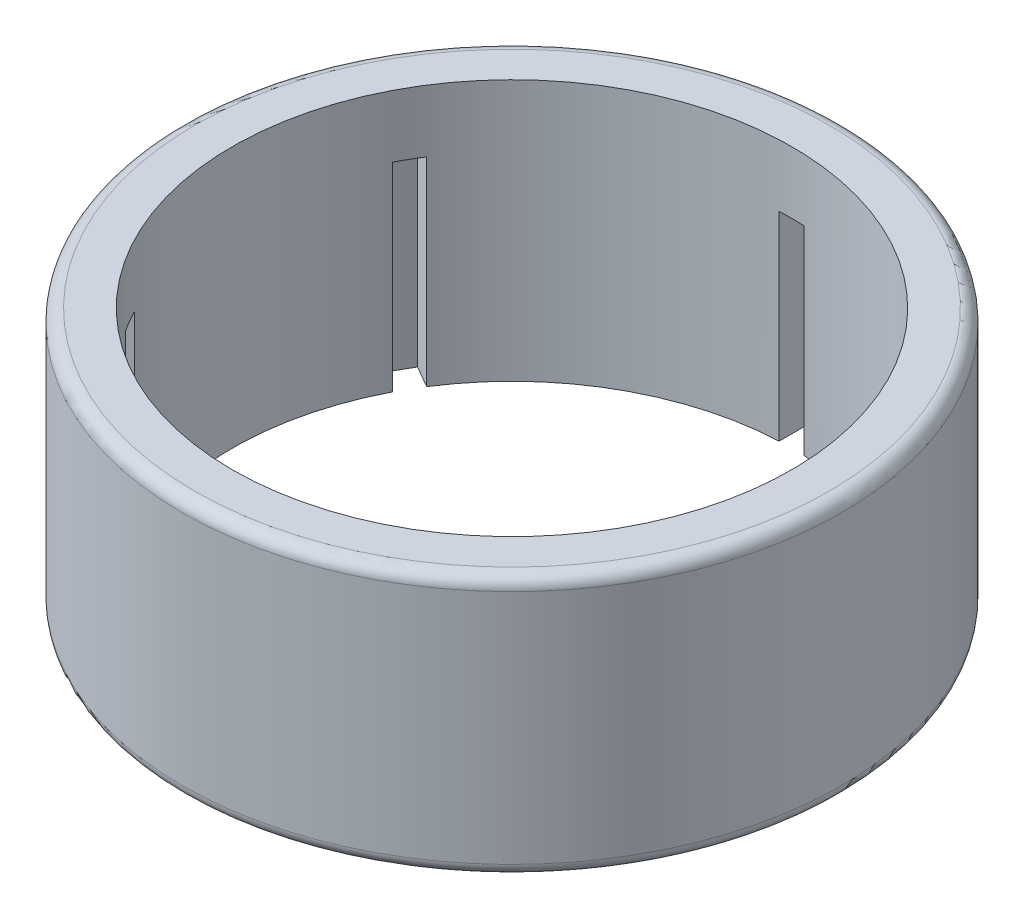
ISO-10303-21;
HEADER;
FILE_DESCRIPTION(('STEP AP214'),'2;1');
FILE_NAME('part.step','',(''),(''),'','','');
FILE_SCHEMA(('AUTOMOTIVE_DESIGN { 1 0 10303 214 1 1 1 1 }'));
ENDSEC;
DATA;
#1=APPLICATION_CONTEXT('core data for automotive mechanical design processes');
#2=APPLICATION_PROTOCOL_DEFINITION('international standard','automotive_design',2000,#1);
#3=PRODUCT_CONTEXT('',#1,'mechanical');
#4=PRODUCT('Part','Part','',(#3));
#5=PRODUCT_RELATED_PRODUCT_CATEGORY('part','',(#4));
#6=PRODUCT_DEFINITION_FORMATION('','',#4);
#7=PRODUCT_DEFINITION_CONTEXT('part definition',#1,'design');
#8=PRODUCT_DEFINITION('design','',#6,#7);
#9=PRODUCT_DEFINITION_SHAPE('','',#8);
#10=(LENGTH_UNIT() NAMED_UNIT(*) SI_UNIT(.MILLI.,.METRE.));
#11=(NAMED_UNIT(*) PLANE_ANGLE_UNIT() SI_UNIT($,.RADIAN.));
#12=(NAMED_UNIT(*) SI_UNIT($,.STERADIAN.) SOLID_ANGLE_UNIT());
#13=UNCERTAINTY_MEASURE_WITH_UNIT(LENGTH_MEASURE(1.E-05),#10,'distance_accuracy_value','');
#14=(GEOMETRIC_REPRESENTATION_CONTEXT(3) GLOBAL_UNCERTAINTY_ASSIGNED_CONTEXT((#13)) GLOBAL_UNIT_ASSIGNED_CONTEXT((#10,
#11,#12)) REPRESENTATION_CONTEXT('',''));
#15=CARTESIAN_POINT('',(0.,0.,0.));
#16=DIRECTION('',(0.,0.,1.));
#17=DIRECTION('',(1.,0.,0.));
#18=AXIS2_PLACEMENT_3D('',#15,#16,#17);
#19=CARTESIAN_POINT('',(0.,0.,0.));
#20=DIRECTION('',(0.,1.,0.));
#21=DIRECTION('',(0.,0.,1.));
#22=AXIS2_PLACEMENT_3D('',#19,#20,#21);
#23=PLANE('',#22);
#24=CARTESIAN_POINT('',(0.,0.,0.));
#25=DIRECTION('',(0.,1.,0.));
#26=DIRECTION('',(0.,0.,1.));
#27=AXIS2_PLACEMENT_3D('',#24,#25,#26);
#28=CIRCLE('',#27,25.5);
#29=CARTESIAN_POINT('',(0.,0.,25.5));
#30=VERTEX_POINT('',#29);
#31=EDGE_CURVE('E64',#30,#30,#28,.F.);
#32=ORIENTED_EDGE('',*,*,#31,.T.);
#33=EDGE_LOOP('',(#32));
#34=FACE_BOUND('',#33,.T.);
#35=DIRECTION('',(-0.866025403784433,0.,0.50000000000001));
#36=VECTOR('',#35,1.);
#37=CARTESIAN_POINT('',(-0.500000000000013,0.,-0.866025403784437));
#38=LINE('',#37,#36);
#39=CARTESIAN_POINT('',(-19.9663170630706,0.,10.3728579927103));
#40=VERTEX_POINT('',#39);
#41=CARTESIAN_POINT('',(-21.6983678706395,0.,11.3728579927103));
#42=VERTEX_POINT('',#41);
#43=EDGE_CURVE('E314',#40,#42,#38,.T.);
#44=ORIENTED_EDGE('',*,*,#43,.T.);
#45=DIRECTION('',(0.50000000000001,0.,0.866025403784433));
#46=VECTOR('',#45,1.);
#47=CARTESIAN_POINT('',(-21.1983678706395,0.,12.2388833964948));
#48=LINE('',#47,#46);
#49=CARTESIAN_POINT('',(-20.6983678706395,0.,13.1049088002792));
#50=VERTEX_POINT('',#49);
#51=EDGE_CURVE('E318',#42,#50,#48,.T.);
#52=ORIENTED_EDGE('',*,*,#51,.T.);
#53=DIRECTION('',(0.866025403784433,0.,-0.50000000000001));
#54=VECTOR('',#53,1.);
#55=CARTESIAN_POINT('',(0.500000000000012,0.,0.866025403784437));
#56=LINE('',#55,#54);
#57=CARTESIAN_POINT('',(-18.9663170630706,0.,12.1049088002792));
#58=VERTEX_POINT('',#57);
#59=EDGE_CURVE('E322',#50,#58,#56,.T.);
#60=ORIENTED_EDGE('',*,*,#59,.T.);
#61=CARTESIAN_POINT('',(0.,0.,0.));
#62=DIRECTION('',(0.,1.,0.));
#63=DIRECTION('',(0.,0.,1.));
#64=AXIS2_PLACEMENT_3D('',#61,#62,#63);
#65=CIRCLE('',#64,22.5);
#66=CARTESIAN_POINT('',(-1.,0.,22.477766792989));
#67=VERTEX_POINT('',#66);
#68=EDGE_CURVE('E391',#58,#67,#65,.T.);
#69=ORIENTED_EDGE('',*,*,#68,.T.);
#70=DIRECTION('',(0.,0.,1.));
#71=VECTOR('',#70,1.);
#72=CARTESIAN_POINT('',(-1.00000000000001,0.,0.));
#73=LINE('',#72,#71);
#74=CARTESIAN_POINT('',(-1.,0.,24.477766792989));
#75=VERTEX_POINT('',#74);
#76=EDGE_CURVE('E368',#67,#75,#73,.T.);
#77=ORIENTED_EDGE('',*,*,#76,.T.);
#78=DIRECTION('',(1.,0.,0.));
#79=VECTOR('',#78,1.);
#80=CARTESIAN_POINT('',(0.,0.,24.477766792989));
#81=LINE('',#80,#79);
#82=CARTESIAN_POINT('',(1.,0.,24.477766792989));
#83=VERTEX_POINT('',#82);
#84=EDGE_CURVE('E373',#75,#83,#81,.T.);
#85=ORIENTED_EDGE('',*,*,#84,.T.);
#86=DIRECTION('',(0.,0.,-1.));
#87=VECTOR('',#86,1.);
#88=CARTESIAN_POINT('',(1.00000000000001,0.,0.));
#89=LINE('',#88,#87);
#90=CARTESIAN_POINT('',(1.,0.,22.477766792989));
#91=VERTEX_POINT('',#90);
#92=EDGE_CURVE('E377',#83,#91,#89,.T.);
#93=ORIENTED_EDGE('',*,*,#92,.T.);
#94=CARTESIAN_POINT('',(18.9663170630708,0.,12.1049088002789));
#95=VERTEX_POINT('',#94);
#96=EDGE_CURVE('E401',#91,#95,#65,.T.);
#97=ORIENTED_EDGE('',*,*,#96,.T.);
#98=DIRECTION('',(0.86602540378444,0.,0.499999999999998));
#99=VECTOR('',#98,1.);
#100=CARTESIAN_POINT('',(-0.5,0.,0.866025403784444));
#101=LINE('',#100,#99);
#102=CARTESIAN_POINT('',(20.6983678706397,0.,13.1049088002789));
#103=VERTEX_POINT('',#102);
#104=EDGE_CURVE('E339',#95,#103,#101,.T.);
#105=ORIENTED_EDGE('',*,*,#104,.T.);
#106=DIRECTION('',(0.499999999999998,0.,-0.86602540378444));
#107=VECTOR('',#106,1.);
#108=CARTESIAN_POINT('',(21.1983678706397,0.,12.2388833964945));
#109=LINE('',#108,#107);
#110=CARTESIAN_POINT('',(21.6983678706397,0.,11.37285799271));
#111=VERTEX_POINT('',#110);
#112=EDGE_CURVE('E344',#103,#111,#109,.T.);
#113=ORIENTED_EDGE('',*,*,#112,.T.);
#114=DIRECTION('',(-0.86602540378444,0.,-0.499999999999998));
#115=VECTOR('',#114,1.);
#116=CARTESIAN_POINT('',(0.500000000000001,0.,-0.866025403784444));
#117=LINE('',#116,#115);
#118=CARTESIAN_POINT('',(19.9663170630708,0.,10.37285799271));
#119=VERTEX_POINT('',#118);
#120=EDGE_CURVE('E348',#111,#119,#117,.T.);
#121=ORIENTED_EDGE('',*,*,#120,.T.);
#122=CARTESIAN_POINT('',(19.9663170630707,0.,-10.3728579927102));
#123=VERTEX_POINT('',#122);
#124=EDGE_CURVE('E404',#119,#123,#65,.T.);
#125=ORIENTED_EDGE('',*,*,#124,.T.);
#126=DIRECTION('',(0.866025403784436,0.,-0.500000000000004));
#127=VECTOR('',#126,1.);
#128=CARTESIAN_POINT('',(0.500000000000007,0.,0.866025403784441));
#129=LINE('',#128,#127);
#130=CARTESIAN_POINT('',(21.6983678706396,0.,-11.3728579927102));
#131=VERTEX_POINT('',#130);
#132=EDGE_CURVE('E256',#123,#131,#129,.T.);
#133=ORIENTED_EDGE('',*,*,#132,.T.);
#134=DIRECTION('',(-0.500000000000004,0.,-0.866025403784436));
#135=VECTOR('',#134,1.);
#136=CARTESIAN_POINT('',(21.1983678706396,0.,-12.2388833964946));
#137=LINE('',#136,#135);
#138=CARTESIAN_POINT('',(20.6983678706396,0.,-13.1049088002791));
#139=VERTEX_POINT('',#138);
#140=EDGE_CURVE('E230',#131,#139,#137,.T.);
#141=ORIENTED_EDGE('',*,*,#140,.T.);
#142=DIRECTION('',(-0.866025403784437,0.,0.500000000000004));
#143=VECTOR('',#142,1.);
#144=CARTESIAN_POINT('',(-0.500000000000007,0.,-0.866025403784441));
#145=LINE('',#144,#143);
#146=CARTESIAN_POINT('',(18.9663170630707,0.,-12.104908800279));
#147=VERTEX_POINT('',#146);
#148=EDGE_CURVE('E225',#139,#147,#145,.T.);
#149=ORIENTED_EDGE('',*,*,#148,.T.);
#150=CARTESIAN_POINT('',(1.,0.,-22.477766792989));
#151=VERTEX_POINT('',#150);
#152=EDGE_CURVE('E842',#147,#151,#65,.T.);
#153=ORIENTED_EDGE('',*,*,#152,.T.);
#154=DIRECTION('',(0.,0.,-1.));
#155=VECTOR('',#154,1.);
#156=CARTESIAN_POINT('',(1.00000000000001,0.,0.));
#157=LINE('',#156,#155);
#158=CARTESIAN_POINT('',(1.,0.,-24.477766792989));
#159=VERTEX_POINT('',#158);
#160=EDGE_CURVE('E259',#151,#159,#157,.T.);
#161=ORIENTED_EDGE('',*,*,#160,.T.);
#162=DIRECTION('',(-1.,0.,0.));
#163=VECTOR('',#162,1.);
#164=CARTESIAN_POINT('',(0.,0.,-24.477766792989));
#165=LINE('',#164,#163);
#166=CARTESIAN_POINT('',(-1.,0.,-24.477766792989));
#167=VERTEX_POINT('',#166);
#168=EDGE_CURVE('E264',#159,#167,#165,.T.);
#169=ORIENTED_EDGE('',*,*,#168,.T.);
#170=DIRECTION('',(0.,0.,1.));
#171=VECTOR('',#170,1.);
#172=CARTESIAN_POINT('',(-1.00000000000001,0.,0.));
#173=LINE('',#172,#171);
#174=CARTESIAN_POINT('',(-1.,0.,-22.477766792989));
#175=VERTEX_POINT('',#174);
#176=EDGE_CURVE('E268',#167,#175,#173,.T.);
#177=ORIENTED_EDGE('',*,*,#176,.T.);
#178=CARTESIAN_POINT('',(-18.9663170630709,0.,-12.1049088002788));
#179=VERTEX_POINT('',#178);
#180=EDGE_CURVE('E847',#175,#179,#65,.T.);
#181=ORIENTED_EDGE('',*,*,#180,.T.);
#182=DIRECTION('',(-0.866025403784443,0.,-0.499999999999992));
#183=VECTOR('',#182,1.);
#184=CARTESIAN_POINT('',(0.499999999999994,0.,-0.866025403784448));
#185=LINE('',#184,#183);
#186=CARTESIAN_POINT('',(-20.6983678706398,0.,-13.1049088002788));
#187=VERTEX_POINT('',#186);
#188=EDGE_CURVE('E288',#179,#187,#185,.T.);
#189=ORIENTED_EDGE('',*,*,#188,.T.);
#190=DIRECTION('',(-0.499999999999992,0.,0.866025403784443));
#191=VECTOR('',#190,1.);
#192=CARTESIAN_POINT('',(-21.1983678706398,0.,-12.2388833964943));
#193=LINE('',#192,#191);
#194=CARTESIAN_POINT('',(-21.6983678706397,0.,-11.3728579927099));
#195=VERTEX_POINT('',#194);
#196=EDGE_CURVE('E292',#187,#195,#193,.T.);
#197=ORIENTED_EDGE('',*,*,#196,.T.);
#198=DIRECTION('',(0.866025403784443,0.,0.499999999999992));
#199=VECTOR('',#198,1.);
#200=CARTESIAN_POINT('',(-0.499999999999995,0.,0.866025403784448));
#201=LINE('',#200,#199);
#202=CARTESIAN_POINT('',(-19.9663170630709,0.,-10.3728579927099));
#203=VERTEX_POINT('',#202);
#204=EDGE_CURVE('E296',#195,#203,#201,.T.);
#205=ORIENTED_EDGE('',*,*,#204,.T.);
#206=EDGE_CURVE('E849',#203,#40,#65,.T.);
#207=ORIENTED_EDGE('',*,*,#206,.T.);
#208=EDGE_LOOP('',(#44,#52,#60,#69,#77,#85,#93,#97,#105,#113,#121,#125,#133,#141,#149,#153,#161,
#169,#177,#181,#189,#197,#205,#207));
#209=FACE_BOUND('',#208,.T.);
#210=ADVANCED_FACE('F56',(#34,#209),#23,.F.);
#211=CARTESIAN_POINT('',(0.,21.,0.));
#212=DIRECTION('',(0.,-1.,0.));
#213=DIRECTION('',(0.,0.,-1.));
#214=AXIS2_PLACEMENT_3D('',#211,#212,#213);
#215=CYLINDRICAL_SURFACE('',#214,22.5);
#216=CARTESIAN_POINT('',(0.,21.,0.));
#217=DIRECTION('',(0.,1.,0.));
#218=DIRECTION('',(0.,0.,1.));
#219=AXIS2_PLACEMENT_3D('',#216,#217,#218);
#220=CIRCLE('',#219,22.5);
#221=CARTESIAN_POINT('',(0.,21.,22.5));
#222=VERTEX_POINT('',#221);
#223=EDGE_CURVE('E397',#222,#222,#220,.T.);
#224=ORIENTED_EDGE('',*,*,#223,.T.);
#225=EDGE_LOOP('',(#224));
#226=FACE_BOUND('',#225,.T.);
#227=CARTESIAN_POINT('',(0.,16.,0.));
#228=DIRECTION('',(0.,1.,0.));
#229=DIRECTION('',(0.,0.,1.));
#230=AXIS2_PLACEMENT_3D('',#227,#228,#229);
#231=CIRCLE('',#230,22.5);
#232=CARTESIAN_POINT('',(-19.9663170630706,16.,10.3728579927103));
#233=VERTEX_POINT('',#232);
#234=CARTESIAN_POINT('',(-18.9663170630706,16.,12.1049088002792));
#235=VERTEX_POINT('',#234);
#236=EDGE_CURVE('E330',#233,#235,#231,.T.);
#237=ORIENTED_EDGE('',*,*,#236,.F.);
#238=DIRECTION('',(0.,-1.,0.));
#239=VECTOR('',#238,1.);
#240=CARTESIAN_POINT('',(-19.9663170630706,24.8637033051563,10.3728579927103));
#241=LINE('',#240,#239);
#242=EDGE_CURVE('E71',#233,#40,#241,.T.);
#243=ORIENTED_EDGE('',*,*,#242,.T.);
#244=ORIENTED_EDGE('',*,*,#206,.F.);
#245=DIRECTION('',(0.,-1.,0.));
#246=VECTOR('',#245,1.);
#247=CARTESIAN_POINT('',(-19.9663170630709,24.8637033051563,-10.3728579927099));
#248=LINE('',#247,#246);
#249=CARTESIAN_POINT('',(-19.9663170630709,16.,-10.3728579927099));
#250=VERTEX_POINT('',#249);
#251=EDGE_CURVE('E306',#250,#203,#248,.T.);
#252=ORIENTED_EDGE('',*,*,#251,.F.);
#253=CARTESIAN_POINT('',(0.,16.,0.));
#254=DIRECTION('',(0.,1.,0.));
#255=DIRECTION('',(0.,0.,1.));
#256=AXIS2_PLACEMENT_3D('',#253,#254,#255);
#257=CIRCLE('',#256,22.5);
#258=CARTESIAN_POINT('',(-18.9663170630709,16.,-12.1049088002788));
#259=VERTEX_POINT('',#258);
#260=EDGE_CURVE('E304',#259,#250,#257,.T.);
#261=ORIENTED_EDGE('',*,*,#260,.F.);
#262=DIRECTION('',(0.,-1.,0.));
#263=VECTOR('',#262,1.);
#264=CARTESIAN_POINT('',(-18.9663170630709,24.8637033051563,-12.1049088002788));
#265=LINE('',#264,#263);
#266=EDGE_CURVE('E79',#259,#179,#265,.T.);
#267=ORIENTED_EDGE('',*,*,#266,.T.);
#268=ORIENTED_EDGE('',*,*,#180,.F.);
#269=DIRECTION('',(0.,-1.,0.));
#270=VECTOR('',#269,1.);
#271=CARTESIAN_POINT('',(-1.,23.8284271247462,-22.477766792989));
#272=LINE('',#271,#270);
#273=CARTESIAN_POINT('',(-1.,16.,-22.477766792989));
#274=VERTEX_POINT('',#273);
#275=EDGE_CURVE('E279',#274,#175,#272,.T.);
#276=ORIENTED_EDGE('',*,*,#275,.F.);
#277=CARTESIAN_POINT('',(0.,16.,0.));
#278=DIRECTION('',(0.,1.,0.));
#279=DIRECTION('',(0.,0.,1.));
#280=AXIS2_PLACEMENT_3D('',#277,#278,#279);
#281=CIRCLE('',#280,22.5);
#282=CARTESIAN_POINT('',(1.,16.,-22.477766792989));
#283=VERTEX_POINT('',#282);
#284=EDGE_CURVE('E277',#283,#274,#281,.T.);
#285=ORIENTED_EDGE('',*,*,#284,.F.);
#286=DIRECTION('',(0.,-1.,0.));
#287=VECTOR('',#286,1.);
#288=CARTESIAN_POINT('',(1.,23.8284271247462,-22.477766792989));
#289=LINE('',#288,#287);
#290=EDGE_CURVE('E263',#283,#151,#289,.T.);
#291=ORIENTED_EDGE('',*,*,#290,.T.);
#292=ORIENTED_EDGE('',*,*,#152,.F.);
#293=DIRECTION('',(0.,-1.,0.));
#294=VECTOR('',#293,1.);
#295=CARTESIAN_POINT('',(18.9663170630707,24.8637033051563,-12.104908800279));
#296=LINE('',#295,#294);
#297=CARTESIAN_POINT('',(18.9663170630707,16.,-12.104908800279));
#298=VERTEX_POINT('',#297);
#299=EDGE_CURVE('E250',#298,#147,#296,.T.);
#300=ORIENTED_EDGE('',*,*,#299,.F.);
#301=CARTESIAN_POINT('',(0.,16.,0.));
#302=DIRECTION('',(0.,1.,0.));
#303=DIRECTION('',(0.,0.,1.));
#304=AXIS2_PLACEMENT_3D('',#301,#302,#303);
#305=CIRCLE('',#304,22.5);
#306=CARTESIAN_POINT('',(19.9663170630707,16.,-10.3728579927102));
#307=VERTEX_POINT('',#306);
#308=EDGE_CURVE('E238',#307,#298,#305,.T.);
#309=ORIENTED_EDGE('',*,*,#308,.F.);
#310=DIRECTION('',(0.,-1.,0.));
#311=VECTOR('',#310,1.);
#312=CARTESIAN_POINT('',(19.9663170630707,24.8637033051563,-10.3728579927102));
#313=LINE('',#312,#311);
#314=EDGE_CURVE('E253',#307,#123,#313,.T.);
#315=ORIENTED_EDGE('',*,*,#314,.T.);
#316=ORIENTED_EDGE('',*,*,#124,.F.);
#317=DIRECTION('',(0.,-1.,0.));
#318=VECTOR('',#317,1.);
#319=CARTESIAN_POINT('',(19.9663170630708,24.8637033051563,10.37285799271));
#320=LINE('',#319,#318);
#321=CARTESIAN_POINT('',(19.9663170630708,16.,10.37285799271));
#322=VERTEX_POINT('',#321);
#323=EDGE_CURVE('E359',#322,#119,#320,.T.);
#324=ORIENTED_EDGE('',*,*,#323,.F.);
#325=CARTESIAN_POINT('',(0.,16.,0.));
#326=DIRECTION('',(0.,1.,0.));
#327=DIRECTION('',(0.,0.,1.));
#328=AXIS2_PLACEMENT_3D('',#325,#326,#327);
#329=CIRCLE('',#328,22.5);
#330=CARTESIAN_POINT('',(18.9663170630708,16.,12.1049088002789));
#331=VERTEX_POINT('',#330);
#332=EDGE_CURVE('E239',#331,#322,#329,.T.);
#333=ORIENTED_EDGE('',*,*,#332,.F.);
#334=DIRECTION('',(0.,-1.,0.));
#335=VECTOR('',#334,1.);
#336=CARTESIAN_POINT('',(18.9663170630708,24.8637033051563,12.1049088002789));
#337=LINE('',#336,#335);
#338=EDGE_CURVE('E343',#331,#95,#337,.T.);
#339=ORIENTED_EDGE('',*,*,#338,.T.);
#340=ORIENTED_EDGE('',*,*,#96,.F.);
#341=DIRECTION('',(0.,-1.,0.));
#342=VECTOR('',#341,1.);
#343=CARTESIAN_POINT('',(1.,23.8284271247462,22.477766792989));
#344=LINE('',#343,#342);
#345=CARTESIAN_POINT('',(1.,16.,22.477766792989));
#346=VERTEX_POINT('',#345);
#347=EDGE_CURVE('E388',#346,#91,#344,.T.);
#348=ORIENTED_EDGE('',*,*,#347,.F.);
#349=CARTESIAN_POINT('',(0.,16.,0.));
#350=DIRECTION('',(0.,1.,0.));
#351=DIRECTION('',(0.,0.,1.));
#352=AXIS2_PLACEMENT_3D('',#349,#350,#351);
#353=CIRCLE('',#352,22.5);
#354=CARTESIAN_POINT('',(-1.,16.,22.477766792989));
#355=VERTEX_POINT('',#354);
#356=EDGE_CURVE('E362',#355,#346,#353,.T.);
#357=ORIENTED_EDGE('',*,*,#356,.F.);
#358=DIRECTION('',(0.,-1.,0.));
#359=VECTOR('',#358,1.);
#360=CARTESIAN_POINT('',(-1.,23.8284271247462,22.477766792989));
#361=LINE('',#360,#359);
#362=EDGE_CURVE('E372',#355,#67,#361,.T.);
#363=ORIENTED_EDGE('',*,*,#362,.T.);
#364=ORIENTED_EDGE('',*,*,#68,.F.);
#365=DIRECTION('',(0.,-1.,0.));
#366=VECTOR('',#365,1.);
#367=CARTESIAN_POINT('',(-18.9663170630706,24.8637033051563,12.1049088002792));
#368=LINE('',#367,#366);
#369=EDGE_CURVE('E332',#235,#58,#368,.T.);
#370=ORIENTED_EDGE('',*,*,#369,.F.);
#371=EDGE_LOOP('',(#237,#243,#244,#252,#261,#267,#268,#276,#285,#291,#292,#300,#309,#315,#316,
#324,#333,#339,#340,#348,#357,#363,#364,#370));
#372=FACE_BOUND('',#371,.T.);
#373=ADVANCED_FACE('F434',(#226,#372),#215,.F.);
#374=CARTESIAN_POINT('',(0.,21.,0.));
#375=DIRECTION('',(0.,1.,0.));
#376=DIRECTION('',(0.,0.,1.));
#377=AXIS2_PLACEMENT_3D('',#374,#375,#376);
#378=PLANE('',#377);
#379=CARTESIAN_POINT('',(0.,21.,0.));
#380=DIRECTION('',(0.,1.,0.));
#381=DIRECTION('',(0.,0.,1.));
#382=AXIS2_PLACEMENT_3D('',#379,#380,#381);
#383=CIRCLE('',#382,25.5);
#384=CARTESIAN_POINT('',(0.,21.,25.5));
#385=VERTEX_POINT('',#384);
#386=EDGE_CURVE('E13',#385,#385,#383,.T.);
#387=ORIENTED_EDGE('',*,*,#386,.T.);
#388=EDGE_LOOP('',(#387));
#389=FACE_BOUND('',#388,.T.);
#390=ORIENTED_EDGE('',*,*,#223,.F.);
#391=EDGE_LOOP('',(#390));
#392=FACE_BOUND('',#391,.T.);
#393=ADVANCED_FACE('F424',(#389,#392),#378,.T.);
#394=CARTESIAN_POINT('',(0.,21.,0.));
#395=DIRECTION('',(0.,-1.,0.));
#396=DIRECTION('',(0.,0.,-1.));
#397=AXIS2_PLACEMENT_3D('',#394,#395,#396);
#398=CYLINDRICAL_SURFACE('',#397,26.5);
#399=CARTESIAN_POINT('',(0.,1.,0.));
#400=DIRECTION('',(0.,1.,0.));
#401=DIRECTION('',(0.,0.,1.));
#402=AXIS2_PLACEMENT_3D('',#399,#400,#401);
#403=CIRCLE('',#402,26.5);
#404=CARTESIAN_POINT('',(0.,1.,-26.5));
#405=VERTEX_POINT('',#404);
#406=EDGE_CURVE('E407',#405,#405,#403,.T.);
#407=CARTESIAN_POINT('',(0.,20.,0.));
#408=DIRECTION('',(0.,1.,0.));
#409=DIRECTION('',(0.,0.,1.));
#410=AXIS2_PLACEMENT_3D('',#407,#408,#409);
#411=CIRCLE('',#410,26.5);
#412=CARTESIAN_POINT('',(0.,20.,-26.5));
#413=VERTEX_POINT('',#412);
#414=EDGE_CURVE('E400',#413,#413,#411,.F.);
#415=CARTESIAN_POINT('',(0.,1.,-26.5));
#416=CARTESIAN_POINT('',(0.,1.19791666666667,-26.5));
#417=CARTESIAN_POINT('',(0.,1.39583333333333,-26.5));
#418=CARTESIAN_POINT('',(0.,1.79166666666667,-26.5));
#419=CARTESIAN_POINT('',(0.,1.98958333333334,-26.5));
#420=CARTESIAN_POINT('',(0.,2.38541666666667,-26.5));
#421=CARTESIAN_POINT('',(0.,2.58333333333334,-26.5));
#422=CARTESIAN_POINT('',(0.,2.97916666666667,-26.5));
#423=CARTESIAN_POINT('',(0.,3.17708333333334,-26.5));
#424=CARTESIAN_POINT('',(0.,3.57291666666667,-26.5));
#425=CARTESIAN_POINT('',(0.,3.77083333333333,-26.5));
#426=CARTESIAN_POINT('',(0.,4.16666666666667,-26.5));
#427=CARTESIAN_POINT('',(0.,4.36458333333333,-26.5));
#428=CARTESIAN_POINT('',(0.,4.76041666666667,-26.5));
#429=CARTESIAN_POINT('',(0.,4.95833333333333,-26.5));
#430=CARTESIAN_POINT('',(0.,5.35416666666667,-26.5));
#431=CARTESIAN_POINT('',(0.,5.55208333333333,-26.5));
#432=CARTESIAN_POINT('',(0.,5.94791666666667,-26.5));
#433=CARTESIAN_POINT('',(0.,6.14583333333333,-26.5));
#434=CARTESIAN_POINT('',(0.,6.54166666666667,-26.5));
#435=CARTESIAN_POINT('',(0.,6.73958333333333,-26.5));
#436=CARTESIAN_POINT('',(0.,7.13541666666667,-26.5));
#437=CARTESIAN_POINT('',(0.,7.33333333333333,-26.5));
#438=CARTESIAN_POINT('',(0.,7.72916666666667,-26.5));
#439=CARTESIAN_POINT('',(0.,7.92708333333333,-26.5));
#440=CARTESIAN_POINT('',(0.,8.32291666666667,-26.5));
#441=CARTESIAN_POINT('',(0.,8.52083333333333,-26.5));
#442=CARTESIAN_POINT('',(0.,8.91666666666667,-26.5));
#443=CARTESIAN_POINT('',(0.,9.11458333333333,-26.5));
#444=CARTESIAN_POINT('',(0.,9.51041666666667,-26.5));
#445=CARTESIAN_POINT('',(0.,9.70833333333333,-26.5));
#446=CARTESIAN_POINT('',(0.,10.1041666666667,-26.5));
#447=CARTESIAN_POINT('',(0.,10.3020833333333,-26.5));
#448=CARTESIAN_POINT('',(0.,10.6979166666667,-26.5));
#449=CARTESIAN_POINT('',(0.,10.8958333333333,-26.5));
#450=CARTESIAN_POINT('',(0.,11.2916666666667,-26.5));
#451=CARTESIAN_POINT('',(0.,11.4895833333333,-26.5));
#452=CARTESIAN_POINT('',(0.,11.8854166666667,-26.5));
#453=CARTESIAN_POINT('',(0.,12.0833333333333,-26.5));
#454=CARTESIAN_POINT('',(0.,12.4791666666667,-26.5));
#455=CARTESIAN_POINT('',(0.,12.6770833333333,-26.5));
#456=CARTESIAN_POINT('',(0.,13.0729166666667,-26.5));
#457=CARTESIAN_POINT('',(0.,13.2708333333333,-26.5));
#458=CARTESIAN_POINT('',(0.,13.6666666666667,-26.5));
#459=CARTESIAN_POINT('',(0.,13.8645833333333,-26.5));
#460=CARTESIAN_POINT('',(0.,14.2604166666667,-26.5));
#461=CARTESIAN_POINT('',(0.,14.4583333333333,-26.5));
#462=CARTESIAN_POINT('',(0.,14.8541666666667,-26.5));
#463=CARTESIAN_POINT('',(0.,15.0520833333333,-26.5));
#464=CARTESIAN_POINT('',(0.,15.4479166666667,-26.5));
#465=CARTESIAN_POINT('',(0.,15.6458333333333,-26.5));
#466=CARTESIAN_POINT('',(0.,16.0416666666667,-26.5));
#467=CARTESIAN_POINT('',(0.,16.2395833333333,-26.5));
#468=CARTESIAN_POINT('',(0.,16.6354166666667,-26.5));
#469=CARTESIAN_POINT('',(0.,16.8333333333333,-26.5));
#470=CARTESIAN_POINT('',(0.,17.2291666666667,-26.5));
#471=CARTESIAN_POINT('',(0.,17.4270833333333,-26.5));
#472=CARTESIAN_POINT('',(0.,17.8229166666667,-26.5));
#473=CARTESIAN_POINT('',(0.,18.0208333333333,-26.5));
#474=CARTESIAN_POINT('',(0.,18.4166666666667,-26.5));
#475=CARTESIAN_POINT('',(0.,18.6145833333333,-26.5));
#476=CARTESIAN_POINT('',(0.,19.0104166666667,-26.5));
#477=CARTESIAN_POINT('',(0.,19.2083333333333,-26.5));
#478=CARTESIAN_POINT('',(0.,19.6041666666667,-26.5));
#479=CARTESIAN_POINT('',(0.,19.8020833333333,-26.5));
#480=CARTESIAN_POINT('',(0.,20.,-26.5));
#481=B_SPLINE_CURVE_WITH_KNOTS('',3,(#415,#416,#417,#418,#419,#420,#421,#422,#423,#424,#425,
#426,#427,#428,#429,#430,#431,#432,#433,#434,#435,#436,#437,#438,#439,#440,#441,#442,#443,#444,
#445,#446,#447,#448,#449,#450,#451,#452,#453,#454,#455,#456,#457,#458,#459,#460,#461,#462,#463,
#464,#465,#466,#467,#468,#469,#470,#471,#472,#473,#474,#475,#476,#477,#478,#479,#480),
.UNSPECIFIED.,.F.,.F.,(4,2,2,2,2,2,2,2,2,2,2,2,2,2,2,2,2,2,2,2,2,2,2,2,2,2,2,2,2,2,2,2,4),(0.,
0.593750000000001,1.1875,1.78125,2.375,2.96875,3.5625,4.15625,4.75,5.34375,5.9375,6.53125,7.125,
7.71875,8.3125,8.90625,9.5,10.09375,10.6875,11.28125,11.875,12.46875,13.0625,13.65625,14.25,
14.84375,15.4375,16.03125,16.625,17.21875,17.8125,18.40625,19.),.UNSPECIFIED.);
#482=EDGE_CURVE('BSEAM420',#405,#413,#481,.T.);
#483=ORIENTED_EDGE('',*,*,#406,.T.);
#484=ORIENTED_EDGE('',*,*,#414,.T.);
#485=ORIENTED_EDGE('',*,*,#482,.T.);
#486=ORIENTED_EDGE('',*,*,#482,.F.);
#487=EDGE_LOOP('',(#483,#485,#484,#486));
#488=FACE_BOUND('',#487,.T.);
#489=ADVANCED_FACE('F420',(#488),#398,.T.);
#490=CARTESIAN_POINT('',(-1.00000000000001,23.8284271247462,0.));
#491=DIRECTION('',(1.,0.,0.));
#492=DIRECTION('',(0.,0.,-1.));
#493=AXIS2_PLACEMENT_3D('',#490,#491,#492);
#494=PLANE('',#493);
#495=DIRECTION('',(0.,0.,1.));
#496=VECTOR('',#495,1.);
#497=CARTESIAN_POINT('',(-1.00000000000001,16.,0.));
#498=LINE('',#497,#496);
#499=CARTESIAN_POINT('',(-1.,16.,24.477766792989));
#500=VERTEX_POINT('',#499);
#501=EDGE_CURVE('E380',#355,#500,#498,.T.);
#502=ORIENTED_EDGE('',*,*,#501,.T.);
#503=DIRECTION('',(0.,-1.,0.));
#504=VECTOR('',#503,1.);
#505=CARTESIAN_POINT('',(-1.,23.8284271247462,24.477766792989));
#506=LINE('',#505,#504);
#507=EDGE_CURVE('E371',#500,#75,#506,.T.);
#508=ORIENTED_EDGE('',*,*,#507,.T.);
#509=ORIENTED_EDGE('',*,*,#76,.F.);
#510=ORIENTED_EDGE('',*,*,#362,.F.);
#511=EDGE_LOOP('',(#502,#508,#509,#510));
#512=FACE_BOUND('',#511,.T.);
#513=ADVANCED_FACE('F423',(#512),#494,.T.);
#514=CARTESIAN_POINT('',(0.,23.8284271247462,24.477766792989));
#515=DIRECTION('',(0.,0.,-1.));
#516=DIRECTION('',(-1.,0.,0.));
#517=AXIS2_PLACEMENT_3D('',#514,#515,#516);
#518=PLANE('',#517);
#519=DIRECTION('',(1.,0.,0.));
#520=VECTOR('',#519,1.);
#521=CARTESIAN_POINT('',(0.,16.,24.477766792989));
#522=LINE('',#521,#520);
#523=CARTESIAN_POINT('',(1.,16.,24.477766792989));
#524=VERTEX_POINT('',#523);
#525=EDGE_CURVE('E381',#500,#524,#522,.T.);
#526=ORIENTED_EDGE('',*,*,#525,.T.);
#527=DIRECTION('',(0.,-1.,0.));
#528=VECTOR('',#527,1.);
#529=CARTESIAN_POINT('',(1.,23.8284271247462,24.477766792989));
#530=LINE('',#529,#528);
#531=EDGE_CURVE('E376',#524,#83,#530,.T.);
#532=ORIENTED_EDGE('',*,*,#531,.T.);
#533=ORIENTED_EDGE('',*,*,#84,.F.);
#534=ORIENTED_EDGE('',*,*,#507,.F.);
#535=EDGE_LOOP('',(#526,#532,#533,#534));
#536=FACE_BOUND('',#535,.T.);
#537=ADVANCED_FACE('F482',(#536),#518,.T.);
#538=CARTESIAN_POINT('',(1.00000000000001,23.8284271247462,0.));
#539=DIRECTION('',(-1.,0.,0.));
#540=DIRECTION('',(0.,0.,1.));
#541=AXIS2_PLACEMENT_3D('',#538,#539,#540);
#542=PLANE('',#541);
#543=DIRECTION('',(0.,0.,-1.));
#544=VECTOR('',#543,1.);
#545=CARTESIAN_POINT('',(1.00000000000001,16.,0.));
#546=LINE('',#545,#544);
#547=EDGE_CURVE('E384',#524,#346,#546,.T.);
#548=ORIENTED_EDGE('',*,*,#547,.T.);
#549=ORIENTED_EDGE('',*,*,#347,.T.);
#550=ORIENTED_EDGE('',*,*,#92,.F.);
#551=ORIENTED_EDGE('',*,*,#531,.F.);
#552=EDGE_LOOP('',(#548,#549,#550,#551));
#553=FACE_BOUND('',#552,.T.);
#554=ADVANCED_FACE('F478',(#553),#542,.T.);
#555=CARTESIAN_POINT('',(0.,16.,0.));
#556=DIRECTION('',(0.,1.,0.));
#557=DIRECTION('',(0.,0.,1.));
#558=AXIS2_PLACEMENT_3D('',#555,#556,#557);
#559=PLANE('',#558);
#560=ORIENTED_EDGE('',*,*,#356,.T.);
#561=ORIENTED_EDGE('',*,*,#547,.F.);
#562=ORIENTED_EDGE('',*,*,#525,.F.);
#563=ORIENTED_EDGE('',*,*,#501,.F.);
#564=EDGE_LOOP('',(#560,#561,#562,#563));
#565=FACE_BOUND('',#564,.T.);
#566=ADVANCED_FACE('F474',(#565),#559,.F.);
#567=CARTESIAN_POINT('',(-0.5,24.8637033051563,0.866025403784444));
#568=DIRECTION('',(0.499999999999998,0.,-0.86602540378444));
#569=DIRECTION('',(-0.86602540378444,0.,-0.499999999999998));
#570=AXIS2_PLACEMENT_3D('',#567,#568,#569);
#571=PLANE('',#570);
#572=DIRECTION('',(0.86602540378444,0.,0.499999999999998));
#573=VECTOR('',#572,1.);
#574=CARTESIAN_POINT('',(-0.5,16.,0.866025403784444));
#575=LINE('',#574,#573);
#576=CARTESIAN_POINT('',(20.6983678706397,16.,13.1049088002789));
#577=VERTEX_POINT('',#576);
#578=EDGE_CURVE('E351',#331,#577,#575,.T.);
#579=ORIENTED_EDGE('',*,*,#578,.T.);
#580=DIRECTION('',(0.,-1.,0.));
#581=VECTOR('',#580,1.);
#582=CARTESIAN_POINT('',(20.6983678706397,24.8637033051563,13.1049088002789));
#583=LINE('',#582,#581);
#584=EDGE_CURVE('E342',#577,#103,#583,.T.);
#585=ORIENTED_EDGE('',*,*,#584,.T.);
#586=ORIENTED_EDGE('',*,*,#104,.F.);
#587=ORIENTED_EDGE('',*,*,#338,.F.);
#588=EDGE_LOOP('',(#579,#585,#586,#587));
#589=FACE_BOUND('',#588,.T.);
#590=ADVANCED_FACE('F477',(#589),#571,.T.);
#591=CARTESIAN_POINT('',(21.1983678706397,24.8637033051563,12.2388833964945));
#592=DIRECTION('',(-0.86602540378444,0.,-0.499999999999998));
#593=DIRECTION('',(-0.499999999999998,0.,0.86602540378444));
#594=AXIS2_PLACEMENT_3D('',#591,#592,#593);
#595=PLANE('',#594);
#596=DIRECTION('',(0.499999999999998,0.,-0.86602540378444));
#597=VECTOR('',#596,1.);
#598=CARTESIAN_POINT('',(21.1983678706397,16.,12.2388833964945));
#599=LINE('',#598,#597);
#600=CARTESIAN_POINT('',(21.6983678706397,16.,11.37285799271));
#601=VERTEX_POINT('',#600);
#602=EDGE_CURVE('E352',#577,#601,#599,.T.);
#603=ORIENTED_EDGE('',*,*,#602,.T.);
#604=DIRECTION('',(0.,-1.,0.));
#605=VECTOR('',#604,1.);
#606=CARTESIAN_POINT('',(21.6983678706397,24.8637033051563,11.37285799271));
#607=LINE('',#606,#605);
#608=EDGE_CURVE('E347',#601,#111,#607,.T.);
#609=ORIENTED_EDGE('',*,*,#608,.T.);
#610=ORIENTED_EDGE('',*,*,#112,.F.);
#611=ORIENTED_EDGE('',*,*,#584,.F.);
#612=EDGE_LOOP('',(#603,#609,#610,#611));
#613=FACE_BOUND('',#612,.T.);
#614=ADVANCED_FACE('F498',(#613),#595,.T.);
#615=CARTESIAN_POINT('',(0.500000000000001,24.8637033051563,-0.866025403784444));
#616=DIRECTION('',(-0.499999999999998,0.,0.86602540378444));
#617=DIRECTION('',(0.86602540378444,0.,0.499999999999998));
#618=AXIS2_PLACEMENT_3D('',#615,#616,#617);
#619=PLANE('',#618);
#620=DIRECTION('',(-0.86602540378444,0.,-0.499999999999998));
#621=VECTOR('',#620,1.);
#622=CARTESIAN_POINT('',(0.500000000000001,16.,-0.866025403784444));
#623=LINE('',#622,#621);
#624=EDGE_CURVE('E355',#601,#322,#623,.T.);
#625=ORIENTED_EDGE('',*,*,#624,.T.);
#626=ORIENTED_EDGE('',*,*,#323,.T.);
#627=ORIENTED_EDGE('',*,*,#120,.F.);
#628=ORIENTED_EDGE('',*,*,#608,.F.);
#629=EDGE_LOOP('',(#625,#626,#627,#628));
#630=FACE_BOUND('',#629,.T.);
#631=ADVANCED_FACE('F494',(#630),#619,.T.);
#632=CARTESIAN_POINT('',(0.,16.,0.));
#633=DIRECTION('',(0.,1.,0.));
#634=DIRECTION('',(0.,0.,1.));
#635=AXIS2_PLACEMENT_3D('',#632,#633,#634);
#636=PLANE('',#635);
#637=ORIENTED_EDGE('',*,*,#332,.T.);
#638=ORIENTED_EDGE('',*,*,#624,.F.);
#639=ORIENTED_EDGE('',*,*,#602,.F.);
#640=ORIENTED_EDGE('',*,*,#578,.F.);
#641=EDGE_LOOP('',(#637,#638,#639,#640));
#642=FACE_BOUND('',#641,.T.);
#643=ADVANCED_FACE('F490',(#642),#636,.F.);
#644=CARTESIAN_POINT('',(0.500000000000007,24.8637033051563,0.866025403784441));
#645=DIRECTION('',(-0.500000000000004,0.,-0.866025403784436));
#646=DIRECTION('',(-0.866025403784436,0.,0.500000000000004));
#647=AXIS2_PLACEMENT_3D('',#644,#645,#646);
#648=PLANE('',#647);
#649=DIRECTION('',(0.866025403784436,0.,-0.500000000000004));
#650=VECTOR('',#649,1.);
#651=CARTESIAN_POINT('',(0.500000000000007,16.,0.866025403784441));
#652=LINE('',#651,#650);
#653=CARTESIAN_POINT('',(21.6983678706396,16.,-11.3728579927102));
#654=VERTEX_POINT('',#653);
#655=EDGE_CURVE('E244',#307,#654,#652,.T.);
#656=ORIENTED_EDGE('',*,*,#655,.T.);
#657=DIRECTION('',(0.,-1.,0.));
#658=VECTOR('',#657,1.);
#659=CARTESIAN_POINT('',(21.6983678706396,24.8637033051563,-11.3728579927102));
#660=LINE('',#659,#658);
#661=EDGE_CURVE('E242',#654,#131,#660,.T.);
#662=ORIENTED_EDGE('',*,*,#661,.T.);
#663=ORIENTED_EDGE('',*,*,#132,.F.);
#664=ORIENTED_EDGE('',*,*,#314,.F.);
#665=EDGE_LOOP('',(#656,#662,#663,#664));
#666=FACE_BOUND('',#665,.T.);
#667=ADVANCED_FACE('F493',(#666),#648,.T.);
#668=CARTESIAN_POINT('',(21.1983678706396,24.8637033051563,-12.2388833964946));
#669=DIRECTION('',(-0.866025403784436,0.,0.500000000000004));
#670=DIRECTION('',(0.500000000000004,0.,0.866025403784436));
#671=AXIS2_PLACEMENT_3D('',#668,#669,#670);
#672=PLANE('',#671);
#673=DIRECTION('',(-0.500000000000004,0.,-0.866025403784436));
#674=VECTOR('',#673,1.);
#675=CARTESIAN_POINT('',(21.1983678706396,16.,-12.2388833964946));
#676=LINE('',#675,#674);
#677=CARTESIAN_POINT('',(20.6983678706396,16.,-13.1049088002791));
#678=VERTEX_POINT('',#677);
#679=EDGE_CURVE('E235',#654,#678,#676,.T.);
#680=ORIENTED_EDGE('',*,*,#679,.T.);
#681=DIRECTION('',(0.,-1.,0.));
#682=VECTOR('',#681,1.);
#683=CARTESIAN_POINT('',(20.6983678706396,24.8637033051563,-13.1049088002791));
#684=LINE('',#683,#682);
#685=EDGE_CURVE('E219',#678,#139,#684,.T.);
#686=ORIENTED_EDGE('',*,*,#685,.T.);
#687=ORIENTED_EDGE('',*,*,#140,.F.);
#688=ORIENTED_EDGE('',*,*,#661,.F.);
#689=EDGE_LOOP('',(#680,#686,#687,#688));
#690=FACE_BOUND('',#689,.T.);
#691=ADVANCED_FACE('F241',(#690),#672,.T.);
#692=CARTESIAN_POINT('',(-0.500000000000007,24.8637033051563,-0.866025403784441));
#693=DIRECTION('',(0.500000000000004,0.,0.866025403784436));
#694=DIRECTION('',(0.866025403784436,0.,-0.500000000000004));
#695=AXIS2_PLACEMENT_3D('',#692,#693,#694);
#696=PLANE('',#695);
#697=DIRECTION('',(-0.866025403784436,0.,0.500000000000004));
#698=VECTOR('',#697,1.);
#699=CARTESIAN_POINT('',(-0.500000000000007,16.,-0.866025403784441));
#700=LINE('',#699,#698);
#701=EDGE_CURVE('E222',#678,#298,#700,.T.);
#702=ORIENTED_EDGE('',*,*,#701,.T.);
#703=ORIENTED_EDGE('',*,*,#299,.T.);
#704=ORIENTED_EDGE('',*,*,#148,.F.);
#705=ORIENTED_EDGE('',*,*,#685,.F.);
#706=EDGE_LOOP('',(#702,#703,#704,#705));
#707=FACE_BOUND('',#706,.T.);
#708=ADVANCED_FACE('F221',(#707),#696,.T.);
#709=CARTESIAN_POINT('',(0.,16.,0.));
#710=DIRECTION('',(0.,1.,0.));
#711=DIRECTION('',(0.,0.,1.));
#712=AXIS2_PLACEMENT_3D('',#709,#710,#711);
#713=PLANE('',#712);
#714=ORIENTED_EDGE('',*,*,#308,.T.);
#715=ORIENTED_EDGE('',*,*,#701,.F.);
#716=ORIENTED_EDGE('',*,*,#679,.F.);
#717=ORIENTED_EDGE('',*,*,#655,.F.);
#718=EDGE_LOOP('',(#714,#715,#716,#717));
#719=FACE_BOUND('',#718,.T.);
#720=ADVANCED_FACE('F233',(#719),#713,.F.);
#721=CARTESIAN_POINT('',(1.00000000000001,23.8284271247462,0.));
#722=DIRECTION('',(-1.,0.,0.));
#723=DIRECTION('',(0.,0.,1.));
#724=AXIS2_PLACEMENT_3D('',#721,#722,#723);
#725=PLANE('',#724);
#726=DIRECTION('',(0.,0.,-1.));
#727=VECTOR('',#726,1.);
#728=CARTESIAN_POINT('',(1.00000000000001,16.,0.));
#729=LINE('',#728,#727);
#730=CARTESIAN_POINT('',(1.,16.,-24.477766792989));
#731=VERTEX_POINT('',#730);
#732=EDGE_CURVE('E271',#283,#731,#729,.T.);
#733=ORIENTED_EDGE('',*,*,#732,.T.);
#734=DIRECTION('',(0.,-1.,0.));
#735=VECTOR('',#734,1.);
#736=CARTESIAN_POINT('',(1.,23.8284271247462,-24.477766792989));
#737=LINE('',#736,#735);
#738=EDGE_CURVE('E262',#731,#159,#737,.T.);
#739=ORIENTED_EDGE('',*,*,#738,.T.);
#740=ORIENTED_EDGE('',*,*,#160,.F.);
#741=ORIENTED_EDGE('',*,*,#290,.F.);
#742=EDGE_LOOP('',(#733,#739,#740,#741));
#743=FACE_BOUND('',#742,.T.);
#744=ADVANCED_FACE('F528',(#743),#725,.T.);
#745=CARTESIAN_POINT('',(0.,23.8284271247462,-24.477766792989));
#746=DIRECTION('',(0.,0.,1.));
#747=DIRECTION('',(1.,0.,0.));
#748=AXIS2_PLACEMENT_3D('',#745,#746,#747);
#749=PLANE('',#748);
#750=DIRECTION('',(-1.,0.,0.));
#751=VECTOR('',#750,1.);
#752=CARTESIAN_POINT('',(0.,16.,-24.477766792989));
#753=LINE('',#752,#751);
#754=CARTESIAN_POINT('',(-1.,16.,-24.477766792989));
#755=VERTEX_POINT('',#754);
#756=EDGE_CURVE('E272',#731,#755,#753,.T.);
#757=ORIENTED_EDGE('',*,*,#756,.T.);
#758=DIRECTION('',(0.,-1.,0.));
#759=VECTOR('',#758,1.);
#760=CARTESIAN_POINT('',(-1.,23.8284271247462,-24.477766792989));
#761=LINE('',#760,#759);
#762=EDGE_CURVE('E267',#755,#167,#761,.T.);
#763=ORIENTED_EDGE('',*,*,#762,.T.);
#764=ORIENTED_EDGE('',*,*,#168,.F.);
#765=ORIENTED_EDGE('',*,*,#738,.F.);
#766=EDGE_LOOP('',(#757,#763,#764,#765));
#767=FACE_BOUND('',#766,.T.);
#768=ADVANCED_FACE('F531',(#767),#749,.T.);
#769=CARTESIAN_POINT('',(-1.00000000000001,23.8284271247462,0.));
#770=DIRECTION('',(1.,0.,0.));
#771=DIRECTION('',(0.,0.,-1.));
#772=AXIS2_PLACEMENT_3D('',#769,#770,#771);
#773=PLANE('',#772);
#774=DIRECTION('',(0.,0.,1.));
#775=VECTOR('',#774,1.);
#776=CARTESIAN_POINT('',(-1.00000000000001,16.,0.));
#777=LINE('',#776,#775);
#778=EDGE_CURVE('E251',#755,#274,#777,.T.);
#779=ORIENTED_EDGE('',*,*,#778,.T.);
#780=ORIENTED_EDGE('',*,*,#275,.T.);
#781=ORIENTED_EDGE('',*,*,#176,.F.);
#782=ORIENTED_EDGE('',*,*,#762,.F.);
#783=EDGE_LOOP('',(#779,#780,#781,#782));
#784=FACE_BOUND('',#783,.T.);
#785=ADVANCED_FACE('F526',(#784),#773,.T.);
#786=CARTESIAN_POINT('',(0.,16.,0.));
#787=DIRECTION('',(0.,1.,0.));
#788=DIRECTION('',(0.,0.,1.));
#789=AXIS2_PLACEMENT_3D('',#786,#787,#788);
#790=PLANE('',#789);
#791=ORIENTED_EDGE('',*,*,#284,.T.);
#792=ORIENTED_EDGE('',*,*,#778,.F.);
#793=ORIENTED_EDGE('',*,*,#756,.F.);
#794=ORIENTED_EDGE('',*,*,#732,.F.);
#795=EDGE_LOOP('',(#791,#792,#793,#794));
#796=FACE_BOUND('',#795,.T.);
#797=ADVANCED_FACE('F517',(#796),#790,.F.);
#798=CARTESIAN_POINT('',(0.499999999999994,24.8637033051563,-0.866025403784448));
#799=DIRECTION('',(-0.499999999999992,0.,0.866025403784443));
#800=DIRECTION('',(0.866025403784443,0.,0.499999999999992));
#801=AXIS2_PLACEMENT_3D('',#798,#799,#800);
#802=PLANE('',#801);
#803=DIRECTION('',(-0.866025403784443,0.,-0.499999999999992));
#804=VECTOR('',#803,1.);
#805=CARTESIAN_POINT('',(0.499999999999994,16.,-0.866025403784448));
#806=LINE('',#805,#804);
#807=CARTESIAN_POINT('',(-20.6983678706398,16.,-13.1049088002788));
#808=VERTEX_POINT('',#807);
#809=EDGE_CURVE('E299',#259,#808,#806,.T.);
#810=ORIENTED_EDGE('',*,*,#809,.T.);
#811=DIRECTION('',(0.,-1.,0.));
#812=VECTOR('',#811,1.);
#813=CARTESIAN_POINT('',(-20.6983678706398,24.8637033051563,-13.1049088002788));
#814=LINE('',#813,#812);
#815=EDGE_CURVE('E291',#808,#187,#814,.T.);
#816=ORIENTED_EDGE('',*,*,#815,.T.);
#817=ORIENTED_EDGE('',*,*,#188,.F.);
#818=ORIENTED_EDGE('',*,*,#266,.F.);
#819=EDGE_LOOP('',(#810,#816,#817,#818));
#820=FACE_BOUND('',#819,.T.);
#821=ADVANCED_FACE('F513',(#820),#802,.T.);
#822=CARTESIAN_POINT('',(-21.1983678706398,24.8637033051563,-12.2388833964943));
#823=DIRECTION('',(0.866025403784443,0.,0.499999999999992));
#824=DIRECTION('',(0.499999999999992,0.,-0.866025403784443));
#825=AXIS2_PLACEMENT_3D('',#822,#823,#824);
#826=PLANE('',#825);
#827=DIRECTION('',(-0.499999999999992,0.,0.866025403784443));
#828=VECTOR('',#827,1.);
#829=CARTESIAN_POINT('',(-21.1983678706398,16.,-12.2388833964943));
#830=LINE('',#829,#828);
#831=CARTESIAN_POINT('',(-21.6983678706397,16.,-11.3728579927099));
#832=VERTEX_POINT('',#831);
#833=EDGE_CURVE('E300',#808,#832,#830,.T.);
#834=ORIENTED_EDGE('',*,*,#833,.T.);
#835=DIRECTION('',(0.,-1.,0.));
#836=VECTOR('',#835,1.);
#837=CARTESIAN_POINT('',(-21.6983678706397,24.8637033051563,-11.3728579927099));
#838=LINE('',#837,#836);
#839=EDGE_CURVE('E295',#832,#195,#838,.T.);
#840=ORIENTED_EDGE('',*,*,#839,.T.);
#841=ORIENTED_EDGE('',*,*,#196,.F.);
#842=ORIENTED_EDGE('',*,*,#815,.F.);
#843=EDGE_LOOP('',(#834,#840,#841,#842));
#844=FACE_BOUND('',#843,.T.);
#845=ADVANCED_FACE('F516',(#844),#826,.T.);
#846=CARTESIAN_POINT('',(-0.499999999999995,24.8637033051563,0.866025403784448));
#847=DIRECTION('',(0.499999999999992,0.,-0.866025403784443));
#848=DIRECTION('',(-0.866025403784443,0.,-0.499999999999992));
#849=AXIS2_PLACEMENT_3D('',#846,#847,#848);
#850=PLANE('',#849);
#851=DIRECTION('',(0.866025403784443,0.,0.499999999999992));
#852=VECTOR('',#851,1.);
#853=CARTESIAN_POINT('',(-0.499999999999995,16.,0.866025403784448));
#854=LINE('',#853,#852);
#855=EDGE_CURVE('E280',#832,#250,#854,.T.);
#856=ORIENTED_EDGE('',*,*,#855,.T.);
#857=ORIENTED_EDGE('',*,*,#251,.T.);
#858=ORIENTED_EDGE('',*,*,#204,.F.);
#859=ORIENTED_EDGE('',*,*,#839,.F.);
#860=EDGE_LOOP('',(#856,#857,#858,#859));
#861=FACE_BOUND('',#860,.T.);
#862=ADVANCED_FACE('F464',(#861),#850,.T.);
#863=CARTESIAN_POINT('',(0.,16.,0.));
#864=DIRECTION('',(0.,1.,0.));
#865=DIRECTION('',(0.,0.,1.));
#866=AXIS2_PLACEMENT_3D('',#863,#864,#865);
#867=PLANE('',#866);
#868=ORIENTED_EDGE('',*,*,#260,.T.);
#869=ORIENTED_EDGE('',*,*,#855,.F.);
#870=ORIENTED_EDGE('',*,*,#833,.F.);
#871=ORIENTED_EDGE('',*,*,#809,.F.);
#872=EDGE_LOOP('',(#868,#869,#870,#871));
#873=FACE_BOUND('',#872,.T.);
#874=ADVANCED_FACE('F457',(#873),#867,.F.);
#875=CARTESIAN_POINT('',(-0.500000000000013,24.8637033051563,-0.866025403784437));
#876=DIRECTION('',(0.50000000000001,0.,0.866025403784433));
#877=DIRECTION('',(0.866025403784433,0.,-0.50000000000001));
#878=AXIS2_PLACEMENT_3D('',#875,#876,#877);
#879=PLANE('',#878);
#880=DIRECTION('',(-0.866025403784433,0.,0.50000000000001));
#881=VECTOR('',#880,1.);
#882=CARTESIAN_POINT('',(-0.500000000000013,16.,-0.866025403784437));
#883=LINE('',#882,#881);
#884=CARTESIAN_POINT('',(-21.6983678706395,16.,11.3728579927103));
#885=VERTEX_POINT('',#884);
#886=EDGE_CURVE('E325',#233,#885,#883,.T.);
#887=ORIENTED_EDGE('',*,*,#886,.T.);
#888=DIRECTION('',(0.,-1.,0.));
#889=VECTOR('',#888,1.);
#890=CARTESIAN_POINT('',(-21.6983678706395,24.8637033051563,11.3728579927103));
#891=LINE('',#890,#889);
#892=EDGE_CURVE('E317',#885,#42,#891,.T.);
#893=ORIENTED_EDGE('',*,*,#892,.T.);
#894=ORIENTED_EDGE('',*,*,#43,.F.);
#895=ORIENTED_EDGE('',*,*,#242,.F.);
#896=EDGE_LOOP('',(#887,#893,#894,#895));
#897=FACE_BOUND('',#896,.T.);
#898=ADVANCED_FACE('F455',(#897),#879,.T.);
#899=CARTESIAN_POINT('',(-21.1983678706395,24.8637033051563,12.2388833964948));
#900=DIRECTION('',(0.866025403784433,0.,-0.50000000000001));
#901=DIRECTION('',(-0.50000000000001,0.,-0.866025403784433));
#902=AXIS2_PLACEMENT_3D('',#899,#900,#901);
#903=PLANE('',#902);
#904=DIRECTION('',(0.50000000000001,0.,0.866025403784433));
#905=VECTOR('',#904,1.);
#906=CARTESIAN_POINT('',(-21.1983678706395,16.,12.2388833964948));
#907=LINE('',#906,#905);
#908=CARTESIAN_POINT('',(-20.6983678706395,16.,13.1049088002792));
#909=VERTEX_POINT('',#908);
#910=EDGE_CURVE('E326',#885,#909,#907,.T.);
#911=ORIENTED_EDGE('',*,*,#910,.T.);
#912=DIRECTION('',(0.,-1.,0.));
#913=VECTOR('',#912,1.);
#914=CARTESIAN_POINT('',(-20.6983678706395,24.8637033051563,13.1049088002792));
#915=LINE('',#914,#913);
#916=EDGE_CURVE('E321',#909,#50,#915,.T.);
#917=ORIENTED_EDGE('',*,*,#916,.T.);
#918=ORIENTED_EDGE('',*,*,#51,.F.);
#919=ORIENTED_EDGE('',*,*,#892,.F.);
#920=EDGE_LOOP('',(#911,#917,#918,#919));
#921=FACE_BOUND('',#920,.T.);
#922=ADVANCED_FACE('F453',(#921),#903,.T.);
#923=CARTESIAN_POINT('',(0.500000000000012,24.8637033051563,0.866025403784437));
#924=DIRECTION('',(-0.50000000000001,0.,-0.866025403784433));
#925=DIRECTION('',(-0.866025403784433,0.,0.50000000000001));
#926=AXIS2_PLACEMENT_3D('',#923,#924,#925);
#927=PLANE('',#926);
#928=DIRECTION('',(0.866025403784433,0.,-0.50000000000001));
#929=VECTOR('',#928,1.);
#930=CARTESIAN_POINT('',(0.500000000000012,16.,0.866025403784437));
#931=LINE('',#930,#929);
#932=EDGE_CURVE('E307',#909,#235,#931,.T.);
#933=ORIENTED_EDGE('',*,*,#932,.T.);
#934=ORIENTED_EDGE('',*,*,#369,.T.);
#935=ORIENTED_EDGE('',*,*,#59,.F.);
#936=ORIENTED_EDGE('',*,*,#916,.F.);
#937=EDGE_LOOP('',(#933,#934,#935,#936));
#938=FACE_BOUND('',#937,.T.);
#939=ADVANCED_FACE('F449',(#938),#927,.T.);
#940=CARTESIAN_POINT('',(0.,16.,0.));
#941=DIRECTION('',(0.,1.,0.));
#942=DIRECTION('',(0.,0.,1.));
#943=AXIS2_PLACEMENT_3D('',#940,#941,#942);
#944=PLANE('',#943);
#945=ORIENTED_EDGE('',*,*,#236,.T.);
#946=ORIENTED_EDGE('',*,*,#932,.F.);
#947=ORIENTED_EDGE('',*,*,#910,.F.);
#948=ORIENTED_EDGE('',*,*,#886,.F.);
#949=EDGE_LOOP('',(#945,#946,#947,#948));
#950=FACE_BOUND('',#949,.T.);
#951=ADVANCED_FACE('F417',(#950),#944,.F.);
#952=CARTESIAN_POINT('',(0.,1.,0.));
#953=DIRECTION('',(0.,1.,0.));
#954=DIRECTION('',(0.,0.,1.));
#955=AXIS2_PLACEMENT_3D('',#952,#953,#954);
#956=TOROIDAL_SURFACE('',#955,25.5,1.);
#957=ORIENTED_EDGE('',*,*,#31,.F.);
#958=EDGE_LOOP('',(#957));
#959=FACE_BOUND('',#958,.T.);
#960=ORIENTED_EDGE('',*,*,#406,.F.);
#961=EDGE_LOOP('',(#960));
#962=FACE_BOUND('',#961,.T.);
#963=ADVANCED_FACE('F414',(#959,#962),#956,.T.);
#964=CARTESIAN_POINT('',(0.,20.,0.));
#965=DIRECTION('',(0.,1.,0.));
#966=DIRECTION('',(0.,0.,1.));
#967=AXIS2_PLACEMENT_3D('',#964,#965,#966);
#968=TOROIDAL_SURFACE('',#967,25.5,1.);
#969=ORIENTED_EDGE('',*,*,#414,.F.);
#970=EDGE_LOOP('',(#969));
#971=FACE_BOUND('',#970,.T.);
#972=ORIENTED_EDGE('',*,*,#386,.F.);
#973=EDGE_LOOP('',(#972));
#974=FACE_BOUND('',#973,.T.);
#975=ADVANCED_FACE('F58',(#971,#974),#968,.T.);
#976=CLOSED_SHELL('',(#210,#373,#393,#489,#513,#537,#554,#566,#590,#614,#631,#643,#667,#691,
#708,#720,#744,#768,#785,#797,#821,#845,#862,#874,#898,#922,#939,#951,#963,#975));
#977=MANIFOLD_SOLID_BREP('B2',#976);
#978=ADVANCED_BREP_SHAPE_REPRESENTATION('',(#18,#977),#14);
#979=SHAPE_DEFINITION_REPRESENTATION(#9,#978);
ENDSEC;
END-ISO-10303-21;
